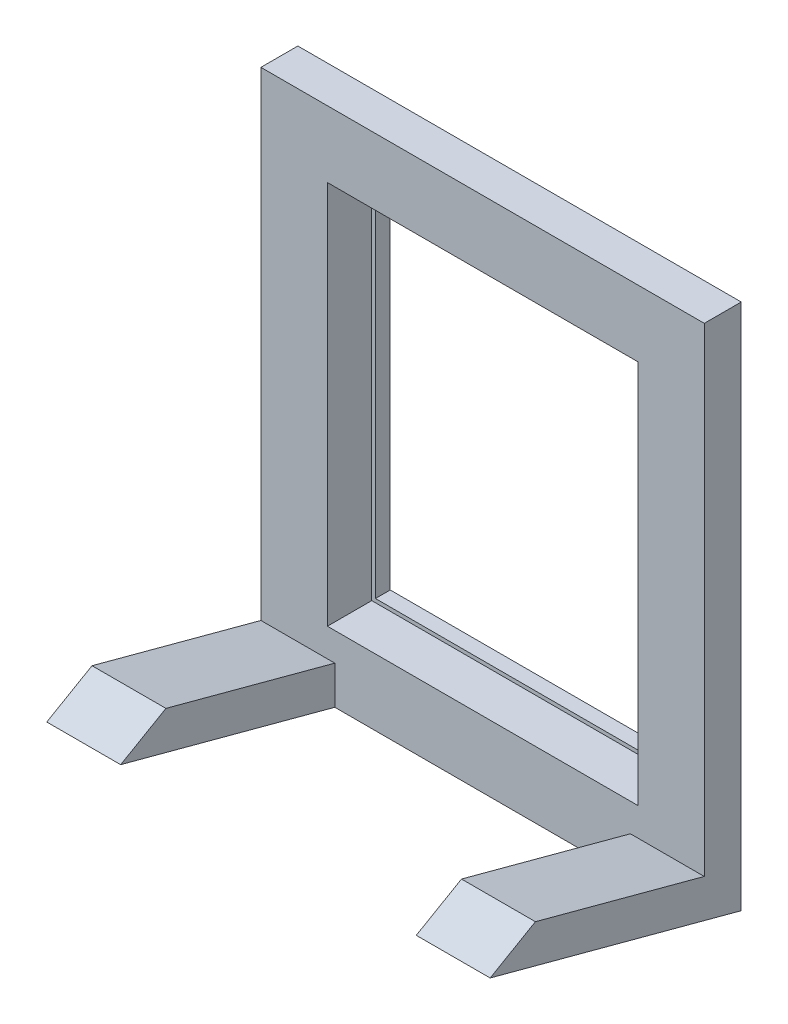
ISO-10303-21;
HEADER;
FILE_DESCRIPTION(('STEP AP214'),'2;1');
FILE_NAME('part.step','',(''),(''),'','','');
FILE_SCHEMA(('AUTOMOTIVE_DESIGN { 1 0 10303 214 1 1 1 1 }'));
ENDSEC;
DATA;
#1=APPLICATION_CONTEXT('core data for automotive mechanical design processes');
#2=APPLICATION_PROTOCOL_DEFINITION('international standard','automotive_design',2000,#1);
#3=PRODUCT_CONTEXT('',#1,'mechanical');
#4=PRODUCT('Part','Part','',(#3));
#5=PRODUCT_RELATED_PRODUCT_CATEGORY('part','',(#4));
#6=PRODUCT_DEFINITION_FORMATION('','',#4);
#7=PRODUCT_DEFINITION_CONTEXT('part definition',#1,'design');
#8=PRODUCT_DEFINITION('design','',#6,#7);
#9=PRODUCT_DEFINITION_SHAPE('','',#8);
#10=(LENGTH_UNIT() NAMED_UNIT(*) SI_UNIT(.MILLI.,.METRE.));
#11=(NAMED_UNIT(*) PLANE_ANGLE_UNIT() SI_UNIT($,.RADIAN.));
#12=(NAMED_UNIT(*) SI_UNIT($,.STERADIAN.) SOLID_ANGLE_UNIT());
#13=UNCERTAINTY_MEASURE_WITH_UNIT(LENGTH_MEASURE(1.E-05),#10,'distance_accuracy_value','');
#14=(GEOMETRIC_REPRESENTATION_CONTEXT(3) GLOBAL_UNCERTAINTY_ASSIGNED_CONTEXT((#13)) GLOBAL_UNIT_ASSIGNED_CONTEXT((#10,
#11,#12)) REPRESENTATION_CONTEXT('',''));
#15=CARTESIAN_POINT('',(0.,0.,0.));
#16=DIRECTION('',(0.,0.,1.));
#17=DIRECTION('',(1.,0.,0.));
#18=AXIS2_PLACEMENT_3D('',#15,#16,#17);
#19=CARTESIAN_POINT('',(0.,0.,6.));
#20=DIRECTION('',(0.,0.,-1.));
#21=DIRECTION('',(-1.,0.,0.));
#22=AXIS2_PLACEMENT_3D('',#19,#20,#21);
#23=PLANE('',#22);
#24=DIRECTION('',(-1.,0.,0.));
#25=VECTOR('',#24,1.);
#26=CARTESIAN_POINT('',(21.,-26.,6.));
#27=LINE('',#26,#25);
#28=CARTESIAN_POINT('',(21.,-26.,6.));
#29=VERTEX_POINT('',#28);
#30=CARTESIAN_POINT('',(-21.,-26.,6.));
#31=VERTEX_POINT('',#30);
#32=EDGE_CURVE('E299',#29,#31,#27,.T.);
#33=ORIENTED_EDGE('',*,*,#32,.T.);
#34=DIRECTION('',(0.,1.,0.));
#35=VECTOR('',#34,1.);
#36=CARTESIAN_POINT('',(-21.,26.,6.));
#37=LINE('',#36,#35);
#38=CARTESIAN_POINT('',(-21.,26.,6.));
#39=VERTEX_POINT('',#38);
#40=EDGE_CURVE('E289',#31,#39,#37,.T.);
#41=ORIENTED_EDGE('',*,*,#40,.T.);
#42=DIRECTION('',(1.,0.,0.));
#43=VECTOR('',#42,1.);
#44=CARTESIAN_POINT('',(21.,26.,6.));
#45=LINE('',#44,#43);
#46=CARTESIAN_POINT('',(21.,26.,6.));
#47=VERTEX_POINT('',#46);
#48=EDGE_CURVE('E292',#39,#47,#45,.T.);
#49=ORIENTED_EDGE('',*,*,#48,.T.);
#50=DIRECTION('',(0.,-1.,0.));
#51=VECTOR('',#50,1.);
#52=CARTESIAN_POINT('',(21.,26.,6.));
#53=LINE('',#52,#51);
#54=EDGE_CURVE('E296',#47,#29,#53,.T.);
#55=ORIENTED_EDGE('',*,*,#54,.T.);
#56=EDGE_LOOP('',(#33,#41,#49,#55));
#57=FACE_BOUND('',#56,.T.);
#58=DIRECTION('',(0.,-1.,0.));
#59=VECTOR('',#58,1.);
#60=CARTESIAN_POINT('',(-30.,-35.,6.));
#61=LINE('',#60,#59);
#62=CARTESIAN_POINT('',(-30.,35.,6.));
#63=VERTEX_POINT('',#62);
#64=CARTESIAN_POINT('',(-30.,-29.8236190979496,6.));
#65=VERTEX_POINT('',#64);
#66=EDGE_CURVE('E334',#63,#65,#61,.T.);
#67=ORIENTED_EDGE('',*,*,#66,.T.);
#68=DIRECTION('',(-1.,0.,0.));
#69=VECTOR('',#68,1.);
#70=CARTESIAN_POINT('',(-20.,-29.8236190979496,6.));
#71=LINE('',#70,#69);
#72=CARTESIAN_POINT('',(-20.,-29.8236190979496,6.));
#73=VERTEX_POINT('',#72);
#74=EDGE_CURVE('E55',#73,#65,#71,.T.);
#75=ORIENTED_EDGE('',*,*,#74,.F.);
#76=DIRECTION('',(0.,-1.,0.));
#77=VECTOR('',#76,1.);
#78=CARTESIAN_POINT('',(-20.,0.,6.));
#79=LINE('',#78,#77);
#80=CARTESIAN_POINT('',(-20.,-35.,6.));
#81=VERTEX_POINT('',#80);
#82=EDGE_CURVE('E227',#73,#81,#79,.T.);
#83=ORIENTED_EDGE('',*,*,#82,.T.);
#84=DIRECTION('',(1.,0.,0.));
#85=VECTOR('',#84,1.);
#86=CARTESIAN_POINT('',(-30.,-35.,6.));
#87=LINE('',#86,#85);
#88=CARTESIAN_POINT('',(20.,-35.,6.));
#89=VERTEX_POINT('',#88);
#90=EDGE_CURVE('E63',#81,#89,#87,.T.);
#91=ORIENTED_EDGE('',*,*,#90,.T.);
#92=DIRECTION('',(0.,-1.,0.));
#93=VECTOR('',#92,1.);
#94=CARTESIAN_POINT('',(20.,0.,6.));
#95=LINE('',#94,#93);
#96=CARTESIAN_POINT('',(20.,-29.8236190979496,6.));
#97=VERTEX_POINT('',#96);
#98=EDGE_CURVE('E260',#97,#89,#95,.T.);
#99=ORIENTED_EDGE('',*,*,#98,.F.);
#100=DIRECTION('',(1.,0.,0.));
#101=VECTOR('',#100,1.);
#102=CARTESIAN_POINT('',(20.,-29.8236190979496,6.));
#103=LINE('',#102,#101);
#104=CARTESIAN_POINT('',(30.,-29.8236190979496,6.));
#105=VERTEX_POINT('',#104);
#106=EDGE_CURVE('E250',#97,#105,#103,.T.);
#107=ORIENTED_EDGE('',*,*,#106,.T.);
#108=DIRECTION('',(0.,1.,0.));
#109=VECTOR('',#108,1.);
#110=CARTESIAN_POINT('',(30.,-35.,6.));
#111=LINE('',#110,#109);
#112=CARTESIAN_POINT('',(30.,35.,6.));
#113=VERTEX_POINT('',#112);
#114=EDGE_CURVE('E329',#105,#113,#111,.T.);
#115=ORIENTED_EDGE('',*,*,#114,.T.);
#116=DIRECTION('',(-1.,0.,0.));
#117=VECTOR('',#116,1.);
#118=CARTESIAN_POINT('',(-30.,35.,6.));
#119=LINE('',#118,#117);
#120=EDGE_CURVE('E331',#113,#63,#119,.T.);
#121=ORIENTED_EDGE('',*,*,#120,.T.);
#122=EDGE_LOOP('',(#67,#75,#83,#91,#99,#107,#115,#121));
#123=FACE_BOUND('',#122,.T.);
#124=ADVANCED_FACE('F38',(#57,#123),#23,.F.);
#125=CARTESIAN_POINT('',(30.,-35.,-2.));
#126=DIRECTION('',(1.,0.,0.));
#127=DIRECTION('',(0.,1.,0.));
#128=AXIS2_PLACEMENT_3D('',#125,#126,#127);
#129=PLANE('',#128);
#130=DIRECTION('',(0.,0.258819045102521,0.965925826289068));
#131=VECTOR('',#130,1.);
#132=CARTESIAN_POINT('',(30.,-34.1554445662277,9.15192378864671));
#133=LINE('',#132,#131);
#134=CARTESIAN_POINT('',(30.,-36.3397459621556,1.));
#135=VERTEX_POINT('',#134);
#136=CARTESIAN_POINT('',(30.,-27.2354286469244,34.9777747886721));
#137=VERTEX_POINT('',#136);
#138=EDGE_CURVE('E243',#135,#137,#133,.T.);
#139=ORIENTED_EDGE('',*,*,#138,.F.);
#140=DIRECTION('',(0.,1.,0.));
#141=VECTOR('',#140,1.);
#142=CARTESIAN_POINT('',(30.,-36.3397459621556,1.));
#143=LINE('',#142,#141);
#144=CARTESIAN_POINT('',(30.,-35.,1.));
#145=VERTEX_POINT('',#144);
#146=EDGE_CURVE('E214',#135,#145,#143,.T.);
#147=ORIENTED_EDGE('',*,*,#146,.T.);
#148=DIRECTION('',(0.,1.,0.));
#149=VECTOR('',#148,1.);
#150=CARTESIAN_POINT('',(30.,-35.,1.));
#151=LINE('',#150,#149);
#152=CARTESIAN_POINT('',(30.,35.,1.));
#153=VERTEX_POINT('',#152);
#154=EDGE_CURVE('E266',#145,#153,#151,.T.);
#155=ORIENTED_EDGE('',*,*,#154,.T.);
#156=DIRECTION('',(0.,0.,1.));
#157=VECTOR('',#156,1.);
#158=CARTESIAN_POINT('',(30.,35.,-2.));
#159=LINE('',#158,#157);
#160=EDGE_CURVE('E465',#153,#113,#159,.T.);
#161=ORIENTED_EDGE('',*,*,#160,.T.);
#162=ORIENTED_EDGE('',*,*,#114,.F.);
#163=DIRECTION('',(0.,-0.258819045102521,-0.965925826289068));
#164=VECTOR('',#163,1.);
#165=CARTESIAN_POINT('',(30.,-29.3258154347823,7.85782856313409));
#166=LINE('',#165,#164);
#167=CARTESIAN_POINT('',(30.,-23.6998947409916,28.8540504317141));
#168=VERTEX_POINT('',#167);
#169=EDGE_CURVE('E237',#168,#105,#166,.T.);
#170=ORIENTED_EDGE('',*,*,#169,.F.);
#171=DIRECTION('',(0.,0.499999999999995,-0.866025403784442));
#172=VECTOR('',#171,1.);
#173=CARTESIAN_POINT('',(30.,-5.28075071777307,-3.04884284842955));
#174=LINE('',#173,#172);
#175=EDGE_CURVE('E247',#137,#168,#174,.T.);
#176=ORIENTED_EDGE('',*,*,#175,.F.);
#177=EDGE_LOOP('',(#139,#147,#155,#161,#162,#170,#176));
#178=FACE_BOUND('',#177,.T.);
#179=ADVANCED_FACE('F386',(#178),#129,.T.);
#180=CARTESIAN_POINT('',(-30.,-35.,-2.));
#181=DIRECTION('',(-1.,0.,0.));
#182=DIRECTION('',(0.,0.,1.));
#183=AXIS2_PLACEMENT_3D('',#180,#181,#182);
#184=PLANE('',#183);
#185=DIRECTION('',(0.,0.,1.));
#186=VECTOR('',#185,1.);
#187=CARTESIAN_POINT('',(-30.,35.,-2.));
#188=LINE('',#187,#186);
#189=CARTESIAN_POINT('',(-30.,35.,1.));
#190=VERTEX_POINT('',#189);
#191=EDGE_CURVE('E464',#190,#63,#188,.T.);
#192=ORIENTED_EDGE('',*,*,#191,.F.);
#193=DIRECTION('',(0.,-1.,0.));
#194=VECTOR('',#193,1.);
#195=CARTESIAN_POINT('',(-30.,35.,1.));
#196=LINE('',#195,#194);
#197=CARTESIAN_POINT('',(-30.,-35.,1.));
#198=VERTEX_POINT('',#197);
#199=EDGE_CURVE('E220',#190,#198,#196,.T.);
#200=ORIENTED_EDGE('',*,*,#199,.T.);
#201=DIRECTION('',(0.,1.,0.));
#202=VECTOR('',#201,1.);
#203=CARTESIAN_POINT('',(-30.,-36.3397459621556,1.));
#204=LINE('',#203,#202);
#205=CARTESIAN_POINT('',(-30.,-36.3397459621556,1.));
#206=VERTEX_POINT('',#205);
#207=EDGE_CURVE('E211',#206,#198,#204,.T.);
#208=ORIENTED_EDGE('',*,*,#207,.F.);
#209=DIRECTION('',(0.,0.258819045102521,0.965925826289068));
#210=VECTOR('',#209,1.);
#211=CARTESIAN_POINT('',(-30.,-34.1554445662277,9.15192378864671));
#212=LINE('',#211,#210);
#213=CARTESIAN_POINT('',(-30.,-27.2354286469244,34.9777747886721));
#214=VERTEX_POINT('',#213);
#215=EDGE_CURVE('E195',#206,#214,#212,.T.);
#216=ORIENTED_EDGE('',*,*,#215,.T.);
#217=DIRECTION('',(0.,0.499999999999995,-0.866025403784442));
#218=VECTOR('',#217,1.);
#219=CARTESIAN_POINT('',(-30.,-5.28075071777307,-3.04884284842955));
#220=LINE('',#219,#218);
#221=CARTESIAN_POINT('',(-30.,-23.6998947409916,28.8540504317141));
#222=VERTEX_POINT('',#221);
#223=EDGE_CURVE('E205',#214,#222,#220,.T.);
#224=ORIENTED_EDGE('',*,*,#223,.T.);
#225=DIRECTION('',(0.,-0.258819045102521,-0.965925826289068));
#226=VECTOR('',#225,1.);
#227=CARTESIAN_POINT('',(-30.,-29.3258154347823,7.85782856313409));
#228=LINE('',#227,#226);
#229=EDGE_CURVE('E206',#222,#65,#228,.T.);
#230=ORIENTED_EDGE('',*,*,#229,.T.);
#231=ORIENTED_EDGE('',*,*,#66,.F.);
#232=EDGE_LOOP('',(#192,#200,#208,#216,#224,#230,#231));
#233=FACE_BOUND('',#232,.T.);
#234=ADVANCED_FACE('F218',(#233),#184,.T.);
#235=CARTESIAN_POINT('',(-30.,35.,-2.));
#236=DIRECTION('',(0.,1.,0.));
#237=DIRECTION('',(0.,0.,1.));
#238=AXIS2_PLACEMENT_3D('',#235,#236,#237);
#239=PLANE('',#238);
#240=ORIENTED_EDGE('',*,*,#160,.F.);
#241=DIRECTION('',(-1.,0.,0.));
#242=VECTOR('',#241,1.);
#243=CARTESIAN_POINT('',(30.,35.,1.));
#244=LINE('',#243,#242);
#245=EDGE_CURVE('E274',#153,#190,#244,.T.);
#246=ORIENTED_EDGE('',*,*,#245,.T.);
#247=ORIENTED_EDGE('',*,*,#191,.T.);
#248=ORIENTED_EDGE('',*,*,#120,.F.);
#249=EDGE_LOOP('',(#240,#246,#247,#248));
#250=FACE_BOUND('',#249,.T.);
#251=ADVANCED_FACE('F418',(#250),#239,.T.);
#252=CARTESIAN_POINT('',(0.,0.,-2.));
#253=DIRECTION('',(0.,0.,-1.));
#254=DIRECTION('',(-1.,0.,0.));
#255=AXIS2_PLACEMENT_3D('',#252,#253,#254);
#256=PLANE('',#255);
#257=DIRECTION('',(0.,1.,0.));
#258=VECTOR('',#257,1.);
#259=CARTESIAN_POINT('',(-23.,0.,-2.));
#260=LINE('',#259,#258);
#261=CARTESIAN_POINT('',(-23.,-28.,-2.));
#262=VERTEX_POINT('',#261);
#263=CARTESIAN_POINT('',(-23.,28.,-2.));
#264=VERTEX_POINT('',#263);
#265=EDGE_CURVE('E47',#262,#264,#260,.T.);
#266=ORIENTED_EDGE('',*,*,#265,.T.);
#267=DIRECTION('',(1.,0.,0.));
#268=VECTOR('',#267,1.);
#269=CARTESIAN_POINT('',(0.,28.,-2.));
#270=LINE('',#269,#268);
#271=CARTESIAN_POINT('',(23.,28.,-2.));
#272=VERTEX_POINT('',#271);
#273=EDGE_CURVE('E11',#264,#272,#270,.T.);
#274=ORIENTED_EDGE('',*,*,#273,.T.);
#275=DIRECTION('',(0.,-1.,0.));
#276=VECTOR('',#275,1.);
#277=CARTESIAN_POINT('',(23.,0.,-2.));
#278=LINE('',#277,#276);
#279=CARTESIAN_POINT('',(23.,-28.,-2.));
#280=VERTEX_POINT('',#279);
#281=EDGE_CURVE('E446',#272,#280,#278,.T.);
#282=ORIENTED_EDGE('',*,*,#281,.T.);
#283=DIRECTION('',(-1.,0.,0.));
#284=VECTOR('',#283,1.);
#285=CARTESIAN_POINT('',(0.,-28.,-2.));
#286=LINE('',#285,#284);
#287=EDGE_CURVE('E458',#280,#262,#286,.T.);
#288=ORIENTED_EDGE('',*,*,#287,.T.);
#289=EDGE_LOOP('',(#266,#274,#282,#288));
#290=FACE_BOUND('',#289,.T.);
#291=DIRECTION('',(0.,1.,0.));
#292=VECTOR('',#291,1.);
#293=CARTESIAN_POINT('',(20.5,-25.5,-2.));
#294=LINE('',#293,#292);
#295=CARTESIAN_POINT('',(20.5,-25.5,-2.));
#296=VERTEX_POINT('',#295);
#297=CARTESIAN_POINT('',(20.5,25.5,-2.));
#298=VERTEX_POINT('',#297);
#299=EDGE_CURVE('E338',#296,#298,#294,.T.);
#300=ORIENTED_EDGE('',*,*,#299,.T.);
#301=DIRECTION('',(-1.,0.,0.));
#302=VECTOR('',#301,1.);
#303=CARTESIAN_POINT('',(-20.5,25.5,-2.));
#304=LINE('',#303,#302);
#305=CARTESIAN_POINT('',(-20.5,25.5,-2.));
#306=VERTEX_POINT('',#305);
#307=EDGE_CURVE('E486',#298,#306,#304,.T.);
#308=ORIENTED_EDGE('',*,*,#307,.T.);
#309=DIRECTION('',(0.,-1.,0.));
#310=VECTOR('',#309,1.);
#311=CARTESIAN_POINT('',(-20.5,-25.5,-2.));
#312=LINE('',#311,#310);
#313=CARTESIAN_POINT('',(-20.5,-25.5,-2.));
#314=VERTEX_POINT('',#313);
#315=EDGE_CURVE('E484',#306,#314,#312,.T.);
#316=ORIENTED_EDGE('',*,*,#315,.T.);
#317=DIRECTION('',(1.,0.,0.));
#318=VECTOR('',#317,1.);
#319=CARTESIAN_POINT('',(-20.5,-25.5,-2.));
#320=LINE('',#319,#318);
#321=EDGE_CURVE('E474',#314,#296,#320,.T.);
#322=ORIENTED_EDGE('',*,*,#321,.T.);
#323=EDGE_LOOP('',(#300,#308,#316,#322));
#324=FACE_BOUND('',#323,.T.);
#325=ADVANCED_FACE('F414',(#290,#324),#256,.T.);
#326=CARTESIAN_POINT('',(20.5,-25.5,-2.));
#327=DIRECTION('',(1.,0.,0.));
#328=DIRECTION('',(0.,0.,-1.));
#329=AXIS2_PLACEMENT_3D('',#326,#327,#328);
#330=PLANE('',#329);
#331=DIRECTION('',(0.,0.,1.));
#332=VECTOR('',#331,1.);
#333=CARTESIAN_POINT('',(20.5,-25.5,-2.));
#334=LINE('',#333,#332);
#335=CARTESIAN_POINT('',(20.5,-25.5,0.));
#336=VERTEX_POINT('',#335);
#337=EDGE_CURVE('E468',#296,#336,#334,.T.);
#338=ORIENTED_EDGE('',*,*,#337,.T.);
#339=DIRECTION('',(0.,1.,0.));
#340=VECTOR('',#339,1.);
#341=CARTESIAN_POINT('',(20.5,-25.5,0.));
#342=LINE('',#341,#340);
#343=CARTESIAN_POINT('',(20.5,25.5,0.));
#344=VERTEX_POINT('',#343);
#345=EDGE_CURVE('E326',#336,#344,#342,.T.);
#346=ORIENTED_EDGE('',*,*,#345,.T.);
#347=DIRECTION('',(0.,0.,1.));
#348=VECTOR('',#347,1.);
#349=CARTESIAN_POINT('',(20.5,25.5,-2.));
#350=LINE('',#349,#348);
#351=EDGE_CURVE('E470',#298,#344,#350,.T.);
#352=ORIENTED_EDGE('',*,*,#351,.F.);
#353=ORIENTED_EDGE('',*,*,#299,.F.);
#354=EDGE_LOOP('',(#338,#346,#352,#353));
#355=FACE_BOUND('',#354,.T.);
#356=ADVANCED_FACE('F402',(#355),#330,.F.);
#357=CARTESIAN_POINT('',(-20.5,-25.5,-2.));
#358=DIRECTION('',(0.,-1.,0.));
#359=DIRECTION('',(0.,0.,-1.));
#360=AXIS2_PLACEMENT_3D('',#357,#358,#359);
#361=PLANE('',#360);
#362=DIRECTION('',(0.,0.,1.));
#363=VECTOR('',#362,1.);
#364=CARTESIAN_POINT('',(-20.5,-25.5,-2.));
#365=LINE('',#364,#363);
#366=CARTESIAN_POINT('',(-20.5,-25.5,0.));
#367=VERTEX_POINT('',#366);
#368=EDGE_CURVE('E477',#314,#367,#365,.T.);
#369=ORIENTED_EDGE('',*,*,#368,.T.);
#370=DIRECTION('',(1.,0.,0.));
#371=VECTOR('',#370,1.);
#372=CARTESIAN_POINT('',(-20.5,-25.5,0.));
#373=LINE('',#372,#371);
#374=EDGE_CURVE('E323',#367,#336,#373,.T.);
#375=ORIENTED_EDGE('',*,*,#374,.T.);
#376=ORIENTED_EDGE('',*,*,#337,.F.);
#377=ORIENTED_EDGE('',*,*,#321,.F.);
#378=EDGE_LOOP('',(#369,#375,#376,#377));
#379=FACE_BOUND('',#378,.T.);
#380=ADVANCED_FACE('F398',(#379),#361,.F.);
#381=CARTESIAN_POINT('',(-20.5,-25.5,-2.));
#382=DIRECTION('',(-1.,0.,0.));
#383=DIRECTION('',(0.,0.,1.));
#384=AXIS2_PLACEMENT_3D('',#381,#382,#383);
#385=PLANE('',#384);
#386=DIRECTION('',(0.,0.,1.));
#387=VECTOR('',#386,1.);
#388=CARTESIAN_POINT('',(-20.5,25.5,-2.));
#389=LINE('',#388,#387);
#390=CARTESIAN_POINT('',(-20.5,25.5,0.));
#391=VERTEX_POINT('',#390);
#392=EDGE_CURVE('E473',#306,#391,#389,.T.);
#393=ORIENTED_EDGE('',*,*,#392,.T.);
#394=DIRECTION('',(0.,-1.,0.));
#395=VECTOR('',#394,1.);
#396=CARTESIAN_POINT('',(-20.5,-25.5,0.));
#397=LINE('',#396,#395);
#398=EDGE_CURVE('E315',#391,#367,#397,.T.);
#399=ORIENTED_EDGE('',*,*,#398,.T.);
#400=ORIENTED_EDGE('',*,*,#368,.F.);
#401=ORIENTED_EDGE('',*,*,#315,.F.);
#402=EDGE_LOOP('',(#393,#399,#400,#401));
#403=FACE_BOUND('',#402,.T.);
#404=ADVANCED_FACE('F401',(#403),#385,.F.);
#405=CARTESIAN_POINT('',(-20.5,25.5,-2.));
#406=DIRECTION('',(0.,1.,0.));
#407=DIRECTION('',(0.,0.,1.));
#408=AXIS2_PLACEMENT_3D('',#405,#406,#407);
#409=PLANE('',#408);
#410=ORIENTED_EDGE('',*,*,#351,.T.);
#411=DIRECTION('',(-1.,0.,0.));
#412=VECTOR('',#411,1.);
#413=CARTESIAN_POINT('',(-20.5,25.5,0.));
#414=LINE('',#413,#412);
#415=EDGE_CURVE('E461',#344,#391,#414,.T.);
#416=ORIENTED_EDGE('',*,*,#415,.T.);
#417=ORIENTED_EDGE('',*,*,#392,.F.);
#418=ORIENTED_EDGE('',*,*,#307,.F.);
#419=EDGE_LOOP('',(#410,#416,#417,#418));
#420=FACE_BOUND('',#419,.T.);
#421=ADVANCED_FACE('F406',(#420),#409,.F.);
#422=CARTESIAN_POINT('',(0.,0.,0.));
#423=DIRECTION('',(0.,0.,-1.));
#424=DIRECTION('',(-1.,0.,0.));
#425=AXIS2_PLACEMENT_3D('',#422,#423,#424);
#426=PLANE('',#425);
#427=DIRECTION('',(0.,1.,0.));
#428=VECTOR('',#427,1.);
#429=CARTESIAN_POINT('',(-21.,26.,0.));
#430=LINE('',#429,#428);
#431=CARTESIAN_POINT('',(-21.,-26.,0.));
#432=VERTEX_POINT('',#431);
#433=CARTESIAN_POINT('',(-21.,26.,0.));
#434=VERTEX_POINT('',#433);
#435=EDGE_CURVE('E264',#432,#434,#430,.T.);
#436=ORIENTED_EDGE('',*,*,#435,.F.);
#437=DIRECTION('',(-1.,0.,0.));
#438=VECTOR('',#437,1.);
#439=CARTESIAN_POINT('',(21.,-26.,0.));
#440=LINE('',#439,#438);
#441=CARTESIAN_POINT('',(21.,-26.,0.));
#442=VERTEX_POINT('',#441);
#443=EDGE_CURVE('E293',#442,#432,#440,.T.);
#444=ORIENTED_EDGE('',*,*,#443,.F.);
#445=DIRECTION('',(0.,-1.,0.));
#446=VECTOR('',#445,1.);
#447=CARTESIAN_POINT('',(21.,26.,0.));
#448=LINE('',#447,#446);
#449=CARTESIAN_POINT('',(21.,26.,0.));
#450=VERTEX_POINT('',#449);
#451=EDGE_CURVE('E308',#450,#442,#448,.T.);
#452=ORIENTED_EDGE('',*,*,#451,.F.);
#453=DIRECTION('',(1.,0.,0.));
#454=VECTOR('',#453,1.);
#455=CARTESIAN_POINT('',(21.,26.,0.));
#456=LINE('',#455,#454);
#457=EDGE_CURVE('E305',#434,#450,#456,.T.);
#458=ORIENTED_EDGE('',*,*,#457,.F.);
#459=EDGE_LOOP('',(#436,#444,#452,#458));
#460=FACE_BOUND('',#459,.T.);
#461=ORIENTED_EDGE('',*,*,#374,.F.);
#462=ORIENTED_EDGE('',*,*,#398,.F.);
#463=ORIENTED_EDGE('',*,*,#415,.F.);
#464=ORIENTED_EDGE('',*,*,#345,.F.);
#465=EDGE_LOOP('',(#461,#462,#463,#464));
#466=FACE_BOUND('',#465,.T.);
#467=ADVANCED_FACE('F410',(#460,#466),#426,.F.);
#468=CARTESIAN_POINT('',(-21.,26.,6.));
#469=DIRECTION('',(-1.,0.,0.));
#470=DIRECTION('',(0.,-1.,0.));
#471=AXIS2_PLACEMENT_3D('',#468,#469,#470);
#472=PLANE('',#471);
#473=ORIENTED_EDGE('',*,*,#435,.T.);
#474=DIRECTION('',(0.,0.,-1.));
#475=VECTOR('',#474,1.);
#476=CARTESIAN_POINT('',(-21.,26.,6.));
#477=LINE('',#476,#475);
#478=EDGE_CURVE('E302',#39,#434,#477,.T.);
#479=ORIENTED_EDGE('',*,*,#478,.F.);
#480=ORIENTED_EDGE('',*,*,#40,.F.);
#481=DIRECTION('',(0.,0.,-1.));
#482=VECTOR('',#481,1.);
#483=CARTESIAN_POINT('',(-21.,-26.,6.));
#484=LINE('',#483,#482);
#485=EDGE_CURVE('E313',#31,#432,#484,.T.);
#486=ORIENTED_EDGE('',*,*,#485,.T.);
#487=EDGE_LOOP('',(#473,#479,#480,#486));
#488=FACE_BOUND('',#487,.T.);
#489=ADVANCED_FACE('F396',(#488),#472,.F.);
#490=CARTESIAN_POINT('',(21.,-26.,6.));
#491=DIRECTION('',(0.,-1.,0.));
#492=DIRECTION('',(0.,0.,-1.));
#493=AXIS2_PLACEMENT_3D('',#490,#491,#492);
#494=PLANE('',#493);
#495=ORIENTED_EDGE('',*,*,#443,.T.);
#496=ORIENTED_EDGE('',*,*,#485,.F.);
#497=ORIENTED_EDGE('',*,*,#32,.F.);
#498=DIRECTION('',(0.,0.,-1.));
#499=VECTOR('',#498,1.);
#500=CARTESIAN_POINT('',(21.,-26.,6.));
#501=LINE('',#500,#499);
#502=EDGE_CURVE('E316',#29,#442,#501,.T.);
#503=ORIENTED_EDGE('',*,*,#502,.T.);
#504=EDGE_LOOP('',(#495,#496,#497,#503));
#505=FACE_BOUND('',#504,.T.);
#506=ADVANCED_FACE('F501',(#505),#494,.F.);
#507=CARTESIAN_POINT('',(21.,26.,6.));
#508=DIRECTION('',(1.,0.,0.));
#509=DIRECTION('',(0.,1.,0.));
#510=AXIS2_PLACEMENT_3D('',#507,#508,#509);
#511=PLANE('',#510);
#512=ORIENTED_EDGE('',*,*,#451,.T.);
#513=ORIENTED_EDGE('',*,*,#502,.F.);
#514=ORIENTED_EDGE('',*,*,#54,.F.);
#515=DIRECTION('',(0.,0.,-1.));
#516=VECTOR('',#515,1.);
#517=CARTESIAN_POINT('',(21.,26.,6.));
#518=LINE('',#517,#516);
#519=EDGE_CURVE('E318',#47,#450,#518,.T.);
#520=ORIENTED_EDGE('',*,*,#519,.T.);
#521=EDGE_LOOP('',(#512,#513,#514,#520));
#522=FACE_BOUND('',#521,.T.);
#523=ADVANCED_FACE('F509',(#522),#511,.F.);
#524=CARTESIAN_POINT('',(21.,26.,6.));
#525=DIRECTION('',(0.,1.,0.));
#526=DIRECTION('',(0.,0.,1.));
#527=AXIS2_PLACEMENT_3D('',#524,#525,#526);
#528=PLANE('',#527);
#529=ORIENTED_EDGE('',*,*,#457,.T.);
#530=ORIENTED_EDGE('',*,*,#519,.F.);
#531=ORIENTED_EDGE('',*,*,#48,.F.);
#532=ORIENTED_EDGE('',*,*,#478,.T.);
#533=EDGE_LOOP('',(#529,#530,#531,#532));
#534=FACE_BOUND('',#533,.T.);
#535=ADVANCED_FACE('F512',(#534),#528,.F.);
#536=CARTESIAN_POINT('',(-30.,35.,1.));
#537=DIRECTION('',(0.,0.,-1.));
#538=DIRECTION('',(-1.,0.,0.));
#539=AXIS2_PLACEMENT_3D('',#536,#537,#538);
#540=PLANE('',#539);
#541=DIRECTION('',(0.,-1.,0.));
#542=VECTOR('',#541,1.);
#543=CARTESIAN_POINT('',(-26.,35.,1.));
#544=LINE('',#543,#542);
#545=CARTESIAN_POINT('',(-26.,31.,1.));
#546=VERTEX_POINT('',#545);
#547=CARTESIAN_POINT('',(-26.,-31.,1.));
#548=VERTEX_POINT('',#547);
#549=EDGE_CURVE('E285',#546,#548,#544,.T.);
#550=ORIENTED_EDGE('',*,*,#549,.T.);
#551=DIRECTION('',(-0.707106781186548,-0.707106781186548,0.));
#552=VECTOR('',#551,1.);
#553=CARTESIAN_POINT('',(-30.,-35.,1.));
#554=LINE('',#553,#552);
#555=EDGE_CURVE('E279',#548,#198,#554,.T.);
#556=ORIENTED_EDGE('',*,*,#555,.T.);
#557=ORIENTED_EDGE('',*,*,#199,.F.);
#558=DIRECTION('',(-0.707106781186548,0.707106781186548,0.));
#559=VECTOR('',#558,1.);
#560=CARTESIAN_POINT('',(0.,4.99999999999999,1.));
#561=LINE('',#560,#559);
#562=EDGE_CURVE('E277',#546,#190,#561,.T.);
#563=ORIENTED_EDGE('',*,*,#562,.F.);
#564=EDGE_LOOP('',(#550,#556,#557,#563));
#565=FACE_BOUND('',#564,.T.);
#566=ADVANCED_FACE('F440',(#565),#540,.T.);
#567=CARTESIAN_POINT('',(-30.,-35.,1.));
#568=DIRECTION('',(0.,0.,-1.));
#569=DIRECTION('',(-1.,0.,0.));
#570=AXIS2_PLACEMENT_3D('',#567,#568,#569);
#571=PLANE('',#570);
#572=DIRECTION('',(1.,0.,0.));
#573=VECTOR('',#572,1.);
#574=CARTESIAN_POINT('',(-30.,-31.,1.));
#575=LINE('',#574,#573);
#576=CARTESIAN_POINT('',(26.,-31.,1.));
#577=VERTEX_POINT('',#576);
#578=EDGE_CURVE('E283',#548,#577,#575,.T.);
#579=ORIENTED_EDGE('',*,*,#578,.T.);
#580=DIRECTION('',(0.707106781186548,-0.707106781186548,0.));
#581=VECTOR('',#580,1.);
#582=CARTESIAN_POINT('',(30.,-35.,1.));
#583=LINE('',#582,#581);
#584=EDGE_CURVE('E269',#577,#145,#583,.T.);
#585=ORIENTED_EDGE('',*,*,#584,.T.);
#586=ORIENTED_EDGE('',*,*,#146,.F.);
#587=DIRECTION('',(1.,0.,0.));
#588=VECTOR('',#587,1.);
#589=CARTESIAN_POINT('',(-30.,-36.3397459621556,1.));
#590=LINE('',#589,#588);
#591=EDGE_CURVE('E198',#206,#135,#590,.T.);
#592=ORIENTED_EDGE('',*,*,#591,.F.);
#593=ORIENTED_EDGE('',*,*,#207,.T.);
#594=ORIENTED_EDGE('',*,*,#555,.F.);
#595=EDGE_LOOP('',(#579,#585,#586,#592,#593,#594));
#596=FACE_BOUND('',#595,.T.);
#597=ADVANCED_FACE('F209',(#596),#571,.T.);
#598=CARTESIAN_POINT('',(30.,35.,1.));
#599=DIRECTION('',(0.,0.,-1.));
#600=DIRECTION('',(-1.,0.,0.));
#601=AXIS2_PLACEMENT_3D('',#598,#599,#600);
#602=PLANE('',#601);
#603=DIRECTION('',(-1.,0.,0.));
#604=VECTOR('',#603,1.);
#605=CARTESIAN_POINT('',(30.,31.,1.));
#606=LINE('',#605,#604);
#607=CARTESIAN_POINT('',(26.,31.,1.));
#608=VERTEX_POINT('',#607);
#609=EDGE_CURVE('E271',#608,#546,#606,.T.);
#610=ORIENTED_EDGE('',*,*,#609,.T.);
#611=ORIENTED_EDGE('',*,*,#562,.T.);
#612=ORIENTED_EDGE('',*,*,#245,.F.);
#613=DIRECTION('',(0.707106781186548,0.707106781186548,0.));
#614=VECTOR('',#613,1.);
#615=CARTESIAN_POINT('',(-4.99999999999999,0.,1.));
#616=LINE('',#615,#614);
#617=EDGE_CURVE('E261',#608,#153,#616,.T.);
#618=ORIENTED_EDGE('',*,*,#617,.F.);
#619=EDGE_LOOP('',(#610,#611,#612,#618));
#620=FACE_BOUND('',#619,.T.);
#621=ADVANCED_FACE('F521',(#620),#602,.T.);
#622=CARTESIAN_POINT('',(30.,-35.,1.));
#623=DIRECTION('',(0.,0.,-1.));
#624=DIRECTION('',(-1.,0.,0.));
#625=AXIS2_PLACEMENT_3D('',#622,#623,#624);
#626=PLANE('',#625);
#627=ORIENTED_EDGE('',*,*,#584,.F.);
#628=DIRECTION('',(0.,1.,0.));
#629=VECTOR('',#628,1.);
#630=CARTESIAN_POINT('',(26.,-35.,1.));
#631=LINE('',#630,#629);
#632=EDGE_CURVE('E265',#577,#608,#631,.T.);
#633=ORIENTED_EDGE('',*,*,#632,.T.);
#634=ORIENTED_EDGE('',*,*,#617,.T.);
#635=ORIENTED_EDGE('',*,*,#154,.F.);
#636=EDGE_LOOP('',(#627,#633,#634,#635));
#637=FACE_BOUND('',#636,.T.);
#638=ADVANCED_FACE('F438',(#637),#626,.T.);
#639=CARTESIAN_POINT('',(-30.,-31.,0.999999999999989));
#640=DIRECTION('',(0.,0.707106781186546,0.707106781186549));
#641=DIRECTION('',(1.,0.,0.));
#642=AXIS2_PLACEMENT_3D('',#639,#640,#641);
#643=PLANE('',#642);
#644=DIRECTION('',(0.577350269189627,0.577350269189627,-0.577350269189624));
#645=VECTOR('',#644,1.);
#646=CARTESIAN_POINT('',(-27.3333333333333,-32.3333333333333,2.33333333333332));
#647=LINE('',#646,#645);
#648=EDGE_CURVE('E449',#262,#548,#647,.F.);
#649=ORIENTED_EDGE('',*,*,#648,.F.);
#650=ORIENTED_EDGE('',*,*,#287,.F.);
#651=DIRECTION('',(-0.577350269189626,0.577350269189627,-0.577350269189624));
#652=VECTOR('',#651,1.);
#653=CARTESIAN_POINT('',(27.3333333333333,-32.3333333333333,2.33333333333333));
#654=LINE('',#653,#652);
#655=EDGE_CURVE('E287',#577,#280,#654,.T.);
#656=ORIENTED_EDGE('',*,*,#655,.F.);
#657=ORIENTED_EDGE('',*,*,#578,.F.);
#658=EDGE_LOOP('',(#649,#650,#656,#657));
#659=FACE_BOUND('',#658,.T.);
#660=ADVANCED_FACE('F40',(#659),#643,.F.);
#661=CARTESIAN_POINT('',(26.,-35.,0.999999999999989));
#662=DIRECTION('',(-0.707106781186546,0.,0.707106781186549));
#663=DIRECTION('',(0.,1.,0.));
#664=AXIS2_PLACEMENT_3D('',#661,#662,#663);
#665=PLANE('',#664);
#666=ORIENTED_EDGE('',*,*,#655,.T.);
#667=ORIENTED_EDGE('',*,*,#281,.F.);
#668=DIRECTION('',(0.577350269189626,0.577350269189627,0.577350269189624));
#669=VECTOR('',#668,1.);
#670=CARTESIAN_POINT('',(3.99999999999994,8.99999999999991,-21.));
#671=LINE('',#670,#669);
#672=EDGE_CURVE('E452',#608,#272,#671,.F.);
#673=ORIENTED_EDGE('',*,*,#672,.F.);
#674=ORIENTED_EDGE('',*,*,#632,.F.);
#675=EDGE_LOOP('',(#666,#667,#673,#674));
#676=FACE_BOUND('',#675,.T.);
#677=ADVANCED_FACE('F431',(#676),#665,.F.);
#678=CARTESIAN_POINT('',(-26.,35.,0.999999999999989));
#679=DIRECTION('',(0.707106781186546,0.,0.707106781186549));
#680=DIRECTION('',(0.,-1.,0.));
#681=AXIS2_PLACEMENT_3D('',#678,#679,#680);
#682=PLANE('',#681);
#683=ORIENTED_EDGE('',*,*,#648,.T.);
#684=ORIENTED_EDGE('',*,*,#549,.F.);
#685=DIRECTION('',(0.577350269189627,-0.577350269189627,-0.577350269189624));
#686=VECTOR('',#685,1.);
#687=CARTESIAN_POINT('',(-27.3333333333333,32.3333333333333,2.33333333333333));
#688=LINE('',#687,#686);
#689=EDGE_CURVE('E253',#264,#546,#688,.F.);
#690=ORIENTED_EDGE('',*,*,#689,.F.);
#691=ORIENTED_EDGE('',*,*,#265,.F.);
#692=EDGE_LOOP('',(#683,#684,#690,#691));
#693=FACE_BOUND('',#692,.T.);
#694=ADVANCED_FACE('F428',(#693),#682,.F.);
#695=CARTESIAN_POINT('',(30.,31.,0.999999999999989));
#696=DIRECTION('',(0.,-0.707106781186546,0.707106781186549));
#697=DIRECTION('',(-1.,0.,0.));
#698=AXIS2_PLACEMENT_3D('',#695,#696,#697);
#699=PLANE('',#698);
#700=ORIENTED_EDGE('',*,*,#672,.T.);
#701=ORIENTED_EDGE('',*,*,#273,.F.);
#702=ORIENTED_EDGE('',*,*,#689,.T.);
#703=ORIENTED_EDGE('',*,*,#609,.F.);
#704=EDGE_LOOP('',(#700,#701,#702,#703));
#705=FACE_BOUND('',#704,.T.);
#706=ADVANCED_FACE('F425',(#705),#699,.F.);
#707=CARTESIAN_POINT('',(20.,-29.3258154347823,7.85782856313409));
#708=DIRECTION('',(0.,-0.965925826289068,0.258819045102521));
#709=DIRECTION('',(0.,-0.258819045102521,-0.965925826289068));
#710=AXIS2_PLACEMENT_3D('',#707,#708,#709);
#711=PLANE('',#710);
#712=ORIENTED_EDGE('',*,*,#169,.T.);
#713=ORIENTED_EDGE('',*,*,#106,.F.);
#714=DIRECTION('',(0.,-0.258819045102521,-0.965925826289068));
#715=VECTOR('',#714,1.);
#716=CARTESIAN_POINT('',(20.,-29.3258154347823,7.85782856313409));
#717=LINE('',#716,#715);
#718=CARTESIAN_POINT('',(20.,-23.6998947409916,28.8540504317141));
#719=VERTEX_POINT('',#718);
#720=EDGE_CURVE('E240',#719,#97,#717,.T.);
#721=ORIENTED_EDGE('',*,*,#720,.F.);
#722=DIRECTION('',(1.,0.,0.));
#723=VECTOR('',#722,1.);
#724=CARTESIAN_POINT('',(20.,-23.6998947409916,28.8540504317141));
#725=LINE('',#724,#723);
#726=EDGE_CURVE('E257',#719,#168,#725,.T.);
#727=ORIENTED_EDGE('',*,*,#726,.T.);
#728=EDGE_LOOP('',(#712,#713,#721,#727));
#729=FACE_BOUND('',#728,.T.);
#730=ADVANCED_FACE('F364',(#729),#711,.F.);
#731=CARTESIAN_POINT('',(20.,-34.1554445662277,9.15192378864671));
#732=DIRECTION('',(0.,0.965925826289068,-0.258819045102521));
#733=DIRECTION('',(0.,0.258819045102521,0.965925826289068));
#734=AXIS2_PLACEMENT_3D('',#731,#732,#733);
#735=PLANE('',#734);
#736=ORIENTED_EDGE('',*,*,#138,.T.);
#737=DIRECTION('',(1.,0.,0.));
#738=VECTOR('',#737,1.);
#739=CARTESIAN_POINT('',(20.,-27.2354286469244,34.9777747886721));
#740=LINE('',#739,#738);
#741=CARTESIAN_POINT('',(20.,-27.2354286469244,34.9777747886721));
#742=VERTEX_POINT('',#741);
#743=EDGE_CURVE('E254',#742,#137,#740,.T.);
#744=ORIENTED_EDGE('',*,*,#743,.F.);
#745=DIRECTION('',(0.,0.258819045102521,0.965925826289068));
#746=VECTOR('',#745,1.);
#747=CARTESIAN_POINT('',(20.,-34.1554445662277,9.15192378864671));
#748=LINE('',#747,#746);
#749=EDGE_CURVE('E245',#89,#742,#748,.T.);
#750=ORIENTED_EDGE('',*,*,#749,.F.);
#751=ORIENTED_EDGE('',*,*,#90,.F.);
#752=DIRECTION('',(0.,0.258819045102521,0.965925826289068));
#753=VECTOR('',#752,1.);
#754=CARTESIAN_POINT('',(-20.,-34.1554445662277,9.15192378864671));
#755=LINE('',#754,#753);
#756=CARTESIAN_POINT('',(-20.,-27.2354286469244,34.9777747886721));
#757=VERTEX_POINT('',#756);
#758=EDGE_CURVE('E231',#81,#757,#755,.T.);
#759=ORIENTED_EDGE('',*,*,#758,.T.);
#760=DIRECTION('',(-1.,0.,0.));
#761=VECTOR('',#760,1.);
#762=CARTESIAN_POINT('',(-20.,-27.2354286469244,34.9777747886721));
#763=LINE('',#762,#761);
#764=EDGE_CURVE('E200',#757,#214,#763,.T.);
#765=ORIENTED_EDGE('',*,*,#764,.T.);
#766=ORIENTED_EDGE('',*,*,#215,.F.);
#767=ORIENTED_EDGE('',*,*,#591,.T.);
#768=EDGE_LOOP('',(#736,#744,#750,#751,#759,#765,#766,#767));
#769=FACE_BOUND('',#768,.T.);
#770=ADVANCED_FACE('F197',(#769),#735,.F.);
#771=CARTESIAN_POINT('',(20.,-5.28075071777307,-3.04884284842955));
#772=DIRECTION('',(0.,-0.866025403784442,-0.499999999999995));
#773=DIRECTION('',(0.,0.499999999999995,-0.866025403784442));
#774=AXIS2_PLACEMENT_3D('',#771,#772,#773);
#775=PLANE('',#774);
#776=ORIENTED_EDGE('',*,*,#175,.T.);
#777=ORIENTED_EDGE('',*,*,#726,.F.);
#778=DIRECTION('',(0.,0.499999999999995,-0.866025403784442));
#779=VECTOR('',#778,1.);
#780=CARTESIAN_POINT('',(20.,-5.28075071777307,-3.04884284842955));
#781=LINE('',#780,#779);
#782=EDGE_CURVE('E242',#742,#719,#781,.T.);
#783=ORIENTED_EDGE('',*,*,#782,.F.);
#784=ORIENTED_EDGE('',*,*,#743,.T.);
#785=EDGE_LOOP('',(#776,#777,#783,#784));
#786=FACE_BOUND('',#785,.T.);
#787=ADVANCED_FACE('F359',(#786),#775,.F.);
#788=CARTESIAN_POINT('',(20.,0.,0.));
#789=DIRECTION('',(1.,0.,0.));
#790=DIRECTION('',(0.,1.,0.));
#791=AXIS2_PLACEMENT_3D('',#788,#789,#790);
#792=PLANE('',#791);
#793=ORIENTED_EDGE('',*,*,#720,.T.);
#794=ORIENTED_EDGE('',*,*,#98,.T.);
#795=ORIENTED_EDGE('',*,*,#749,.T.);
#796=ORIENTED_EDGE('',*,*,#782,.T.);
#797=EDGE_LOOP('',(#793,#794,#795,#796));
#798=FACE_BOUND('',#797,.T.);
#799=ADVANCED_FACE('F353',(#798),#792,.F.);
#800=CARTESIAN_POINT('',(-20.,-29.3258154347823,7.85782856313409));
#801=DIRECTION('',(0.,0.965925826289068,-0.258819045102521));
#802=DIRECTION('',(0.,0.258819045102521,0.965925826289068));
#803=AXIS2_PLACEMENT_3D('',#800,#801,#802);
#804=PLANE('',#803);
#805=ORIENTED_EDGE('',*,*,#229,.F.);
#806=DIRECTION('',(-1.,0.,0.));
#807=VECTOR('',#806,1.);
#808=CARTESIAN_POINT('',(-20.,-23.6998947409916,28.8540504317141));
#809=LINE('',#808,#807);
#810=CARTESIAN_POINT('',(-20.,-23.6998947409916,28.8540504317141));
#811=VERTEX_POINT('',#810);
#812=EDGE_CURVE('E235',#811,#222,#809,.T.);
#813=ORIENTED_EDGE('',*,*,#812,.F.);
#814=DIRECTION('',(0.,-0.258819045102521,-0.965925826289068));
#815=VECTOR('',#814,1.);
#816=CARTESIAN_POINT('',(-20.,-29.3258154347823,7.85782856313409));
#817=LINE('',#816,#815);
#818=EDGE_CURVE('E224',#811,#73,#817,.T.);
#819=ORIENTED_EDGE('',*,*,#818,.T.);
#820=ORIENTED_EDGE('',*,*,#74,.T.);
#821=EDGE_LOOP('',(#805,#813,#819,#820));
#822=FACE_BOUND('',#821,.T.);
#823=ADVANCED_FACE('F376',(#822),#804,.T.);
#824=CARTESIAN_POINT('',(-20.,-5.28075071777307,-3.04884284842955));
#825=DIRECTION('',(0.,0.866025403784442,0.499999999999995));
#826=DIRECTION('',(0.,-0.499999999999995,0.866025403784442));
#827=AXIS2_PLACEMENT_3D('',#824,#825,#826);
#828=PLANE('',#827);
#829=ORIENTED_EDGE('',*,*,#223,.F.);
#830=ORIENTED_EDGE('',*,*,#764,.F.);
#831=DIRECTION('',(0.,0.499999999999995,-0.866025403784442));
#832=VECTOR('',#831,1.);
#833=CARTESIAN_POINT('',(-20.,-5.28075071777307,-3.04884284842955));
#834=LINE('',#833,#832);
#835=EDGE_CURVE('E228',#757,#811,#834,.T.);
#836=ORIENTED_EDGE('',*,*,#835,.T.);
#837=ORIENTED_EDGE('',*,*,#812,.T.);
#838=EDGE_LOOP('',(#829,#830,#836,#837));
#839=FACE_BOUND('',#838,.T.);
#840=ADVANCED_FACE('F372',(#839),#828,.T.);
#841=CARTESIAN_POINT('',(-20.,0.,0.));
#842=DIRECTION('',(-1.,0.,0.));
#843=DIRECTION('',(0.,1.,0.));
#844=AXIS2_PLACEMENT_3D('',#841,#842,#843);
#845=PLANE('',#844);
#846=ORIENTED_EDGE('',*,*,#818,.F.);
#847=ORIENTED_EDGE('',*,*,#835,.F.);
#848=ORIENTED_EDGE('',*,*,#758,.F.);
#849=ORIENTED_EDGE('',*,*,#82,.F.);
#850=EDGE_LOOP('',(#846,#847,#848,#849));
#851=FACE_BOUND('',#850,.T.);
#852=ADVANCED_FACE('F370',(#851),#845,.F.);
#853=CLOSED_SHELL('',(#124,#179,#234,#251,#325,#356,#380,#404,#421,#467,#489,#506,#523,#535,
#566,#597,#621,#638,#660,#677,#694,#706,#730,#770,#787,#799,#823,#840,#852));
#854=MANIFOLD_SOLID_BREP('B2',#853);
#855=ADVANCED_BREP_SHAPE_REPRESENTATION('',(#18,#854),#14);
#856=SHAPE_DEFINITION_REPRESENTATION(#9,#855);
ENDSEC;
END-ISO-10303-21;
